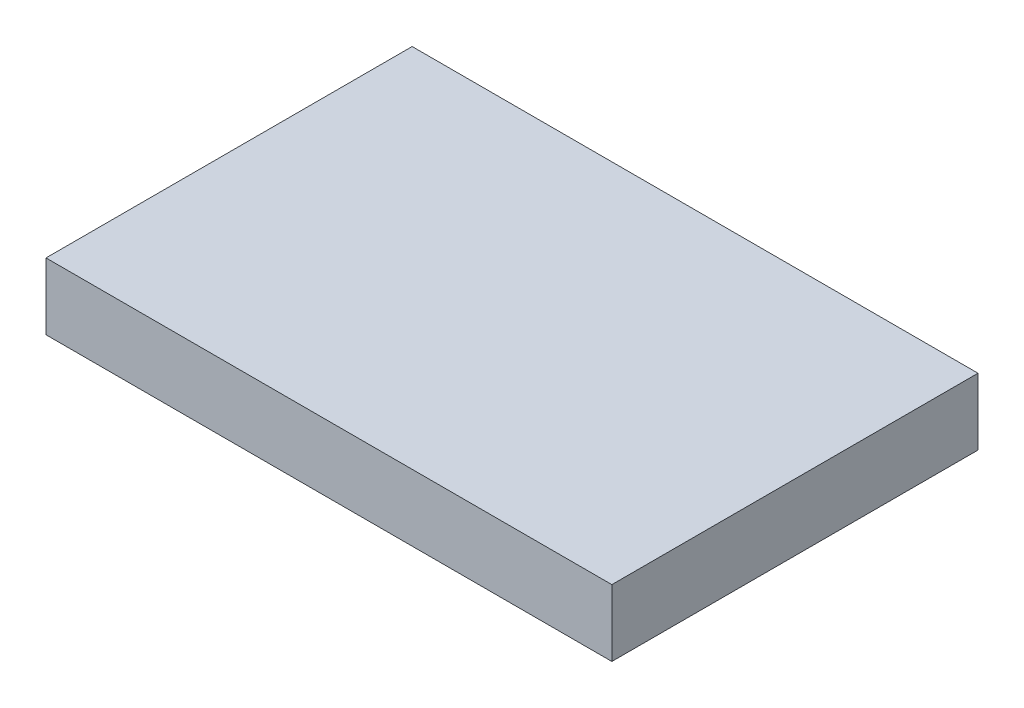
ISO-10303-21;
HEADER;
FILE_DESCRIPTION(('STEP AP214'),'2;1');
FILE_NAME('part.step','',(''),(''),'','','');
FILE_SCHEMA(('AUTOMOTIVE_DESIGN { 1 0 10303 214 1 1 1 1 }'));
ENDSEC;
DATA;
#1=APPLICATION_CONTEXT('core data for automotive mechanical design processes');
#2=APPLICATION_PROTOCOL_DEFINITION('international standard','automotive_design',2000,#1);
#3=PRODUCT_CONTEXT('',#1,'mechanical');
#4=PRODUCT('Part','Part','',(#3));
#5=PRODUCT_RELATED_PRODUCT_CATEGORY('part','',(#4));
#6=PRODUCT_DEFINITION_FORMATION('','',#4);
#7=PRODUCT_DEFINITION_CONTEXT('part definition',#1,'design');
#8=PRODUCT_DEFINITION('design','',#6,#7);
#9=PRODUCT_DEFINITION_SHAPE('','',#8);
#10=(LENGTH_UNIT() NAMED_UNIT(*) SI_UNIT(.MILLI.,.METRE.));
#11=(NAMED_UNIT(*) PLANE_ANGLE_UNIT() SI_UNIT($,.RADIAN.));
#12=(NAMED_UNIT(*) SI_UNIT($,.STERADIAN.) SOLID_ANGLE_UNIT());
#13=UNCERTAINTY_MEASURE_WITH_UNIT(LENGTH_MEASURE(1.E-05),#10,'distance_accuracy_value','');
#14=(GEOMETRIC_REPRESENTATION_CONTEXT(3) GLOBAL_UNCERTAINTY_ASSIGNED_CONTEXT((#13)) GLOBAL_UNIT_ASSIGNED_CONTEXT((#10,
#11,#12)) REPRESENTATION_CONTEXT('',''));
#15=CARTESIAN_POINT('',(0.,0.,0.));
#16=DIRECTION('',(0.,0.,1.));
#17=DIRECTION('',(1.,0.,0.));
#18=AXIS2_PLACEMENT_3D('',#15,#16,#17);
#19=CARTESIAN_POINT('',(42.5,10.,27.5));
#20=DIRECTION('',(-1.,0.,0.));
#21=DIRECTION('',(0.,0.,1.));
#22=AXIS2_PLACEMENT_3D('',#19,#20,#21);
#23=PLANE('',#22);
#24=DIRECTION('',(0.,0.,-1.));
#25=VECTOR('',#24,1.);
#26=CARTESIAN_POINT('',(42.5,0.,27.5));
#27=LINE('',#26,#25);
#28=CARTESIAN_POINT('',(42.5,0.,27.5));
#29=VERTEX_POINT('',#28);
#30=CARTESIAN_POINT('',(42.5,0.,-27.5));
#31=VERTEX_POINT('',#30);
#32=EDGE_CURVE('E102',#29,#31,#27,.T.);
#33=ORIENTED_EDGE('',*,*,#32,.T.);
#34=DIRECTION('',(0.,-1.,0.));
#35=VECTOR('',#34,1.);
#36=CARTESIAN_POINT('',(42.5,10.,-27.5));
#37=LINE('',#36,#35);
#38=CARTESIAN_POINT('',(42.5,10.,-27.5));
#39=VERTEX_POINT('',#38);
#40=EDGE_CURVE('E11',#39,#31,#37,.T.);
#41=ORIENTED_EDGE('',*,*,#40,.F.);
#42=DIRECTION('',(0.,0.,-1.));
#43=VECTOR('',#42,1.);
#44=CARTESIAN_POINT('',(42.5,10.,27.5));
#45=LINE('',#44,#43);
#46=CARTESIAN_POINT('',(42.5,10.,27.5));
#47=VERTEX_POINT('',#46);
#48=EDGE_CURVE('E90',#47,#39,#45,.T.);
#49=ORIENTED_EDGE('',*,*,#48,.F.);
#50=DIRECTION('',(0.,-1.,0.));
#51=VECTOR('',#50,1.);
#52=CARTESIAN_POINT('',(42.5,10.,27.5));
#53=LINE('',#52,#51);
#54=EDGE_CURVE('E98',#47,#29,#53,.T.);
#55=ORIENTED_EDGE('',*,*,#54,.T.);
#56=EDGE_LOOP('',(#33,#41,#49,#55));
#57=FACE_BOUND('',#56,.T.);
#58=ADVANCED_FACE('F39',(#57),#23,.F.);
#59=CARTESIAN_POINT('',(-42.5,10.,-27.5));
#60=DIRECTION('',(0.,0.,1.));
#61=DIRECTION('',(1.,0.,0.));
#62=AXIS2_PLACEMENT_3D('',#59,#60,#61);
#63=PLANE('',#62);
#64=DIRECTION('',(-1.,0.,0.));
#65=VECTOR('',#64,1.);
#66=CARTESIAN_POINT('',(-42.5,0.,-27.5));
#67=LINE('',#66,#65);
#68=CARTESIAN_POINT('',(-42.5,0.,-27.5));
#69=VERTEX_POINT('',#68);
#70=EDGE_CURVE('E94',#31,#69,#67,.T.);
#71=ORIENTED_EDGE('',*,*,#70,.T.);
#72=DIRECTION('',(0.,-1.,0.));
#73=VECTOR('',#72,1.);
#74=CARTESIAN_POINT('',(-42.5,10.,-27.5));
#75=LINE('',#74,#73);
#76=CARTESIAN_POINT('',(-42.5,10.,-27.5));
#77=VERTEX_POINT('',#76);
#78=EDGE_CURVE('E47',#77,#69,#75,.T.);
#79=ORIENTED_EDGE('',*,*,#78,.F.);
#80=DIRECTION('',(-1.,0.,0.));
#81=VECTOR('',#80,1.);
#82=CARTESIAN_POINT('',(-42.5,10.,-27.5));
#83=LINE('',#82,#81);
#84=EDGE_CURVE('E85',#39,#77,#83,.T.);
#85=ORIENTED_EDGE('',*,*,#84,.F.);
#86=ORIENTED_EDGE('',*,*,#40,.T.);
#87=EDGE_LOOP('',(#71,#79,#85,#86));
#88=FACE_BOUND('',#87,.T.);
#89=ADVANCED_FACE('F93',(#88),#63,.F.);
#90=CARTESIAN_POINT('',(-42.5,10.,27.5));
#91=DIRECTION('',(1.,0.,0.));
#92=DIRECTION('',(0.,0.,-1.));
#93=AXIS2_PLACEMENT_3D('',#90,#91,#92);
#94=PLANE('',#93);
#95=DIRECTION('',(0.,0.,1.));
#96=VECTOR('',#95,1.);
#97=CARTESIAN_POINT('',(-42.5,0.,27.5));
#98=LINE('',#97,#96);
#99=CARTESIAN_POINT('',(-42.5,0.,27.5));
#100=VERTEX_POINT('',#99);
#101=EDGE_CURVE('E72',#69,#100,#98,.T.);
#102=ORIENTED_EDGE('',*,*,#101,.T.);
#103=DIRECTION('',(0.,-1.,0.));
#104=VECTOR('',#103,1.);
#105=CARTESIAN_POINT('',(-42.5,10.,27.5));
#106=LINE('',#105,#104);
#107=CARTESIAN_POINT('',(-42.5,10.,27.5));
#108=VERTEX_POINT('',#107);
#109=EDGE_CURVE('E95',#108,#100,#106,.T.);
#110=ORIENTED_EDGE('',*,*,#109,.F.);
#111=DIRECTION('',(0.,0.,1.));
#112=VECTOR('',#111,1.);
#113=CARTESIAN_POINT('',(-42.5,10.,27.5));
#114=LINE('',#113,#112);
#115=EDGE_CURVE('E88',#77,#108,#114,.T.);
#116=ORIENTED_EDGE('',*,*,#115,.F.);
#117=ORIENTED_EDGE('',*,*,#78,.T.);
#118=EDGE_LOOP('',(#102,#110,#116,#117));
#119=FACE_BOUND('',#118,.T.);
#120=ADVANCED_FACE('F96',(#119),#94,.F.);
#121=CARTESIAN_POINT('',(-42.5,10.,27.5));
#122=DIRECTION('',(0.,0.,-1.));
#123=DIRECTION('',(-1.,0.,0.));
#124=AXIS2_PLACEMENT_3D('',#121,#122,#123);
#125=PLANE('',#124);
#126=DIRECTION('',(1.,0.,0.));
#127=VECTOR('',#126,1.);
#128=CARTESIAN_POINT('',(-42.5,0.,27.5));
#129=LINE('',#128,#127);
#130=EDGE_CURVE('E78',#100,#29,#129,.T.);
#131=ORIENTED_EDGE('',*,*,#130,.T.);
#132=ORIENTED_EDGE('',*,*,#54,.F.);
#133=DIRECTION('',(1.,0.,0.));
#134=VECTOR('',#133,1.);
#135=CARTESIAN_POINT('',(-42.5,10.,27.5));
#136=LINE('',#135,#134);
#137=EDGE_CURVE('E55',#108,#47,#136,.T.);
#138=ORIENTED_EDGE('',*,*,#137,.F.);
#139=ORIENTED_EDGE('',*,*,#109,.T.);
#140=EDGE_LOOP('',(#131,#132,#138,#139));
#141=FACE_BOUND('',#140,.T.);
#142=ADVANCED_FACE('F109',(#141),#125,.F.);
#143=CARTESIAN_POINT('',(0.,10.,0.));
#144=DIRECTION('',(0.,-1.,0.));
#145=DIRECTION('',(0.,0.,-1.));
#146=AXIS2_PLACEMENT_3D('',#143,#144,#145);
#147=PLANE('',#146);
#148=ORIENTED_EDGE('',*,*,#48,.T.);
#149=ORIENTED_EDGE('',*,*,#84,.T.);
#150=ORIENTED_EDGE('',*,*,#115,.T.);
#151=ORIENTED_EDGE('',*,*,#137,.T.);
#152=EDGE_LOOP('',(#148,#149,#150,#151));
#153=FACE_BOUND('',#152,.T.);
#154=ADVANCED_FACE('F86',(#153),#147,.F.);
#155=CARTESIAN_POINT('',(0.,0.,0.));
#156=DIRECTION('',(0.,-1.,0.));
#157=DIRECTION('',(0.,0.,-1.));
#158=AXIS2_PLACEMENT_3D('',#155,#156,#157);
#159=PLANE('',#158);
#160=ORIENTED_EDGE('',*,*,#32,.F.);
#161=ORIENTED_EDGE('',*,*,#130,.F.);
#162=ORIENTED_EDGE('',*,*,#101,.F.);
#163=ORIENTED_EDGE('',*,*,#70,.F.);
#164=EDGE_LOOP('',(#160,#161,#162,#163));
#165=FACE_BOUND('',#164,.T.);
#166=ADVANCED_FACE('F112',(#165),#159,.T.);
#167=CLOSED_SHELL('',(#58,#89,#120,#142,#154,#166));
#168=MANIFOLD_SOLID_BREP('B2',#167);
#169=ADVANCED_BREP_SHAPE_REPRESENTATION('',(#18,#168),#14);
#170=SHAPE_DEFINITION_REPRESENTATION(#9,#169);
ENDSEC;
END-ISO-10303-21;
